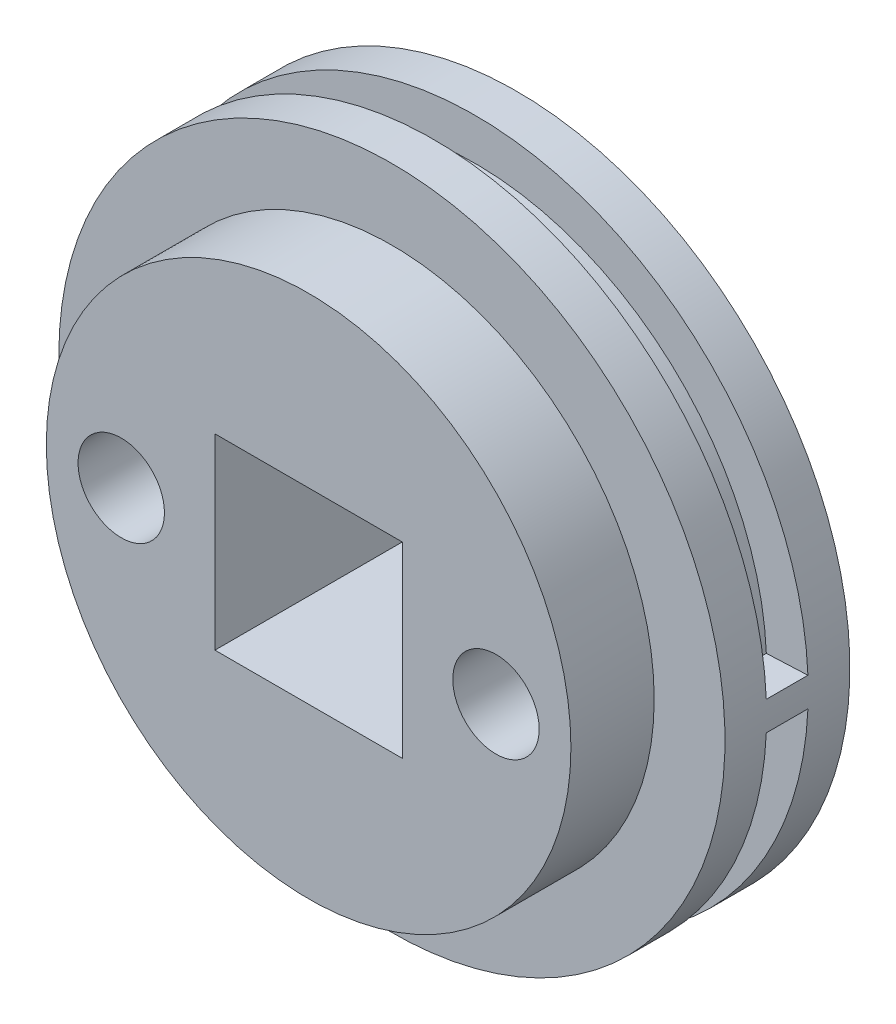
ISO-10303-21;
HEADER;
FILE_DESCRIPTION(('STEP AP214'),'2;1');
FILE_NAME('part.step','',(''),(''),'','','');
FILE_SCHEMA(('AUTOMOTIVE_DESIGN { 1 0 10303 214 1 1 1 1 }'));
ENDSEC;
DATA;
#1=APPLICATION_CONTEXT('core data for automotive mechanical design processes');
#2=APPLICATION_PROTOCOL_DEFINITION('international standard','automotive_design',2000,#1);
#3=PRODUCT_CONTEXT('',#1,'mechanical');
#4=PRODUCT('Part','Part','',(#3));
#5=PRODUCT_RELATED_PRODUCT_CATEGORY('part','',(#4));
#6=PRODUCT_DEFINITION_FORMATION('','',#4);
#7=PRODUCT_DEFINITION_CONTEXT('part definition',#1,'design');
#8=PRODUCT_DEFINITION('design','',#6,#7);
#9=PRODUCT_DEFINITION_SHAPE('','',#8);
#10=(LENGTH_UNIT() NAMED_UNIT(*) SI_UNIT(.MILLI.,.METRE.));
#11=(NAMED_UNIT(*) PLANE_ANGLE_UNIT() SI_UNIT($,.RADIAN.));
#12=(NAMED_UNIT(*) SI_UNIT($,.STERADIAN.) SOLID_ANGLE_UNIT());
#13=UNCERTAINTY_MEASURE_WITH_UNIT(LENGTH_MEASURE(1.E-05),#10,'distance_accuracy_value','');
#14=(GEOMETRIC_REPRESENTATION_CONTEXT(3) GLOBAL_UNCERTAINTY_ASSIGNED_CONTEXT((#13)) GLOBAL_UNIT_ASSIGNED_CONTEXT((#10,
#11,#12)) REPRESENTATION_CONTEXT('',''));
#15=CARTESIAN_POINT('',(0.,0.,0.));
#16=DIRECTION('',(0.,0.,1.));
#17=DIRECTION('',(1.,0.,0.));
#18=AXIS2_PLACEMENT_3D('',#15,#16,#17);
#19=CARTESIAN_POINT('',(9.,0.,-25.));
#20=DIRECTION('',(0.,0.,1.));
#21=DIRECTION('',(1.,0.,0.));
#22=AXIS2_PLACEMENT_3D('',#19,#20,#21);
#23=CYLINDRICAL_SURFACE('',#22,2.075);
#24=CARTESIAN_POINT('',(9.,0.,4.));
#25=DIRECTION('',(0.,0.,1.));
#26=DIRECTION('',(1.,0.,0.));
#27=AXIS2_PLACEMENT_3D('',#24,#25,#26);
#28=CIRCLE('',#27,2.075);
#29=CARTESIAN_POINT('',(11.075,0.,4.));
#30=VERTEX_POINT('',#29);
#31=EDGE_CURVE('E334',#30,#30,#28,.T.);
#32=ORIENTED_EDGE('',*,*,#31,.T.);
#33=EDGE_LOOP('',(#32));
#34=FACE_BOUND('',#33,.T.);
#35=CARTESIAN_POINT('',(9.,0.,-2.5));
#36=DIRECTION('',(0.,0.,-1.));
#37=DIRECTION('',(-1.,0.,0.));
#38=AXIS2_PLACEMENT_3D('',#35,#36,#37);
#39=CIRCLE('',#38,2.075);
#40=CARTESIAN_POINT('',(6.925,0.,-2.5));
#41=VERTEX_POINT('',#40);
#42=EDGE_CURVE('E338',#41,#41,#39,.F.);
#43=ORIENTED_EDGE('',*,*,#42,.F.);
#44=EDGE_LOOP('',(#43));
#45=FACE_BOUND('',#44,.T.);
#46=ADVANCED_FACE('F45',(#34,#45),#23,.F.);
#47=CARTESIAN_POINT('',(-9.,0.,-25.));
#48=DIRECTION('',(0.,0.,1.));
#49=DIRECTION('',(1.,0.,0.));
#50=AXIS2_PLACEMENT_3D('',#47,#48,#49);
#51=CYLINDRICAL_SURFACE('',#50,2.075);
#52=CARTESIAN_POINT('',(-9.,0.,4.));
#53=DIRECTION('',(0.,0.,1.));
#54=DIRECTION('',(1.,0.,0.));
#55=AXIS2_PLACEMENT_3D('',#52,#53,#54);
#56=CIRCLE('',#55,2.075);
#57=CARTESIAN_POINT('',(-6.925,0.,4.));
#58=VERTEX_POINT('',#57);
#59=EDGE_CURVE('E329',#58,#58,#56,.T.);
#60=ORIENTED_EDGE('',*,*,#59,.T.);
#61=EDGE_LOOP('',(#60));
#62=FACE_BOUND('',#61,.T.);
#63=CARTESIAN_POINT('',(-9.,0.,-2.5));
#64=DIRECTION('',(0.,0.,-1.));
#65=DIRECTION('',(-1.,0.,0.));
#66=AXIS2_PLACEMENT_3D('',#63,#64,#65);
#67=CIRCLE('',#66,2.075);
#68=CARTESIAN_POINT('',(-11.075,0.,-2.5));
#69=VERTEX_POINT('',#68);
#70=EDGE_CURVE('E277',#69,#69,#67,.F.);
#71=ORIENTED_EDGE('',*,*,#70,.F.);
#72=EDGE_LOOP('',(#71));
#73=FACE_BOUND('',#72,.T.);
#74=ADVANCED_FACE('F388',(#62,#73),#51,.F.);
#75=CARTESIAN_POINT('',(0.,0.,4.));
#76=DIRECTION('',(0.,0.,-1.));
#77=DIRECTION('',(-1.,0.,0.));
#78=AXIS2_PLACEMENT_3D('',#75,#76,#77);
#79=CYLINDRICAL_SURFACE('',#78,12.6);
#80=CARTESIAN_POINT('',(0.,0.,4.));
#81=DIRECTION('',(0.,0.,1.));
#82=DIRECTION('',(1.,0.,0.));
#83=AXIS2_PLACEMENT_3D('',#80,#81,#82);
#84=CIRCLE('',#83,12.6);
#85=CARTESIAN_POINT('',(12.6,0.,4.));
#86=VERTEX_POINT('',#85);
#87=EDGE_CURVE('E346',#86,#86,#84,.T.);
#88=ORIENTED_EDGE('',*,*,#87,.F.);
#89=EDGE_LOOP('',(#88));
#90=FACE_BOUND('',#89,.T.);
#91=CARTESIAN_POINT('',(0.,0.,0.));
#92=DIRECTION('',(0.,0.,1.));
#93=DIRECTION('',(1.,0.,0.));
#94=AXIS2_PLACEMENT_3D('',#91,#92,#93);
#95=CIRCLE('',#94,12.6);
#96=CARTESIAN_POINT('',(12.6,0.,0.));
#97=VERTEX_POINT('',#96);
#98=EDGE_CURVE('E342',#97,#97,#95,.T.);
#99=ORIENTED_EDGE('',*,*,#98,.T.);
#100=EDGE_LOOP('',(#99));
#101=FACE_BOUND('',#100,.T.);
#102=ADVANCED_FACE('F47',(#90,#101),#79,.T.);
#103=CARTESIAN_POINT('',(0.,0.,4.));
#104=DIRECTION('',(0.,0.,1.));
#105=DIRECTION('',(1.,0.,0.));
#106=AXIS2_PLACEMENT_3D('',#103,#104,#105);
#107=PLANE('',#106);
#108=DIRECTION('',(0.,1.,0.));
#109=VECTOR('',#108,1.);
#110=CARTESIAN_POINT('',(-4.5,4.5,4.));
#111=LINE('',#110,#109);
#112=CARTESIAN_POINT('',(-4.5,-4.5,4.));
#113=VERTEX_POINT('',#112);
#114=CARTESIAN_POINT('',(-4.5,4.5,4.));
#115=VERTEX_POINT('',#114);
#116=EDGE_CURVE('E201',#113,#115,#111,.T.);
#117=ORIENTED_EDGE('',*,*,#116,.T.);
#118=DIRECTION('',(1.,0.,0.));
#119=VECTOR('',#118,1.);
#120=CARTESIAN_POINT('',(4.5,4.5,4.));
#121=LINE('',#120,#119);
#122=CARTESIAN_POINT('',(4.5,4.5,4.));
#123=VERTEX_POINT('',#122);
#124=EDGE_CURVE('E205',#115,#123,#121,.T.);
#125=ORIENTED_EDGE('',*,*,#124,.T.);
#126=DIRECTION('',(0.,-1.,0.));
#127=VECTOR('',#126,1.);
#128=CARTESIAN_POINT('',(4.5,4.5,4.));
#129=LINE('',#128,#127);
#130=CARTESIAN_POINT('',(4.5,-4.5,4.));
#131=VERTEX_POINT('',#130);
#132=EDGE_CURVE('E61',#123,#131,#129,.T.);
#133=ORIENTED_EDGE('',*,*,#132,.T.);
#134=DIRECTION('',(-1.,0.,0.));
#135=VECTOR('',#134,1.);
#136=CARTESIAN_POINT('',(4.5,-4.5,4.));
#137=LINE('',#136,#135);
#138=EDGE_CURVE('E212',#131,#113,#137,.T.);
#139=ORIENTED_EDGE('',*,*,#138,.T.);
#140=EDGE_LOOP('',(#117,#125,#133,#139));
#141=FACE_BOUND('',#140,.T.);
#142=ORIENTED_EDGE('',*,*,#59,.F.);
#143=EDGE_LOOP('',(#142));
#144=FACE_BOUND('',#143,.T.);
#145=ORIENTED_EDGE('',*,*,#31,.F.);
#146=EDGE_LOOP('',(#145));
#147=FACE_BOUND('',#146,.T.);
#148=ORIENTED_EDGE('',*,*,#87,.T.);
#149=EDGE_LOOP('',(#148));
#150=FACE_BOUND('',#149,.T.);
#151=ADVANCED_FACE('F409',(#141,#144,#147,#150),#107,.T.);
#152=CARTESIAN_POINT('',(0.,0.,-6.));
#153=DIRECTION('',(0.,0.,1.));
#154=DIRECTION('',(1.,0.,0.));
#155=AXIS2_PLACEMENT_3D('',#152,#153,#154);
#156=CYLINDRICAL_SURFACE('',#155,16.);
#157=DIRECTION('',(0.,0.,1.));
#158=VECTOR('',#157,1.);
#159=CARTESIAN_POINT('',(15.9847715453097,0.697910197845271,-6.));
#160=LINE('',#159,#158);
#161=CARTESIAN_POINT('',(15.9847715453097,0.697910197845271,-4.));
#162=VERTEX_POINT('',#161);
#163=CARTESIAN_POINT('',(15.9847715453097,0.697910197845271,-2.));
#164=VERTEX_POINT('',#163);
#165=EDGE_CURVE('E11',#162,#164,#160,.T.);
#166=ORIENTED_EDGE('',*,*,#165,.T.);
#167=CARTESIAN_POINT('',(0.,0.,-2.));
#168=DIRECTION('',(0.,0.,1.));
#169=DIRECTION('',(1.,0.,0.));
#170=AXIS2_PLACEMENT_3D('',#167,#168,#169);
#171=CIRCLE('',#170,16.);
#172=CARTESIAN_POINT('',(15.9847715453097,-0.697910197845271,-2.));
#173=VERTEX_POINT('',#172);
#174=EDGE_CURVE('E362',#164,#173,#171,.T.);
#175=ORIENTED_EDGE('',*,*,#174,.T.);
#176=DIRECTION('',(0.,0.,1.));
#177=VECTOR('',#176,1.);
#178=CARTESIAN_POINT('',(15.9847715453097,-0.697910197845271,-6.));
#179=LINE('',#178,#177);
#180=CARTESIAN_POINT('',(15.9847715453097,-0.697910197845271,-4.));
#181=VERTEX_POINT('',#180);
#182=EDGE_CURVE('E54',#173,#181,#179,.F.);
#183=ORIENTED_EDGE('',*,*,#182,.T.);
#184=CARTESIAN_POINT('',(0.,0.,-4.));
#185=DIRECTION('',(0.,0.,-1.));
#186=DIRECTION('',(-1.,0.,0.));
#187=AXIS2_PLACEMENT_3D('',#184,#185,#186);
#188=CIRCLE('',#187,16.);
#189=EDGE_CURVE('E350',#181,#162,#188,.T.);
#190=ORIENTED_EDGE('',*,*,#189,.T.);
#191=EDGE_LOOP('',(#166,#175,#183,#190));
#192=FACE_BOUND('',#191,.T.);
#193=CARTESIAN_POINT('',(0.,0.,-6.));
#194=DIRECTION('',(0.,0.,-1.));
#195=DIRECTION('',(-1.,0.,0.));
#196=AXIS2_PLACEMENT_3D('',#193,#194,#195);
#197=CIRCLE('',#196,16.);
#198=CARTESIAN_POINT('',(-16.,0.,-6.));
#199=VERTEX_POINT('',#198);
#200=EDGE_CURVE('E339',#199,#199,#197,.T.);
#201=ORIENTED_EDGE('',*,*,#200,.F.);
#202=EDGE_LOOP('',(#201));
#203=FACE_BOUND('',#202,.T.);
#204=CARTESIAN_POINT('',(0.,0.,0.));
#205=DIRECTION('',(0.,0.,-1.));
#206=DIRECTION('',(-1.,0.,0.));
#207=AXIS2_PLACEMENT_3D('',#204,#205,#206);
#208=CIRCLE('',#207,16.);
#209=CARTESIAN_POINT('',(-16.,0.,0.));
#210=VERTEX_POINT('',#209);
#211=EDGE_CURVE('E333',#210,#210,#208,.T.);
#212=ORIENTED_EDGE('',*,*,#211,.T.);
#213=EDGE_LOOP('',(#212));
#214=FACE_BOUND('',#213,.T.);
#215=ADVANCED_FACE('F368',(#192,#203,#214),#156,.T.);
#216=CARTESIAN_POINT('',(0.,0.,-6.));
#217=DIRECTION('',(0.,0.,-1.));
#218=DIRECTION('',(-1.,0.,0.));
#219=AXIS2_PLACEMENT_3D('',#216,#217,#218);
#220=PLANE('',#219);
#221=DIRECTION('',(0.,1.,0.));
#222=VECTOR('',#221,1.);
#223=CARTESIAN_POINT('',(-4.5,4.5,-6.));
#224=LINE('',#223,#222);
#225=CARTESIAN_POINT('',(-4.5,-4.5,-6.));
#226=VERTEX_POINT('',#225);
#227=CARTESIAN_POINT('',(-4.5,4.5,-6.));
#228=VERTEX_POINT('',#227);
#229=EDGE_CURVE('E69',#226,#228,#224,.T.);
#230=ORIENTED_EDGE('',*,*,#229,.F.);
#231=DIRECTION('',(-1.,0.,0.));
#232=VECTOR('',#231,1.);
#233=CARTESIAN_POINT('',(4.5,-4.5,-6.));
#234=LINE('',#233,#232);
#235=CARTESIAN_POINT('',(4.5,-4.5,-6.));
#236=VERTEX_POINT('',#235);
#237=EDGE_CURVE('E206',#236,#226,#234,.T.);
#238=ORIENTED_EDGE('',*,*,#237,.F.);
#239=DIRECTION('',(0.,-1.,0.));
#240=VECTOR('',#239,1.);
#241=CARTESIAN_POINT('',(4.5,4.5,-6.));
#242=LINE('',#241,#240);
#243=CARTESIAN_POINT('',(4.5,4.5,-6.));
#244=VERTEX_POINT('',#243);
#245=EDGE_CURVE('E223',#244,#236,#242,.T.);
#246=ORIENTED_EDGE('',*,*,#245,.F.);
#247=DIRECTION('',(1.,0.,0.));
#248=VECTOR('',#247,1.);
#249=CARTESIAN_POINT('',(4.5,4.5,-6.));
#250=LINE('',#249,#248);
#251=EDGE_CURVE('E219',#228,#244,#250,.T.);
#252=ORIENTED_EDGE('',*,*,#251,.F.);
#253=EDGE_LOOP('',(#230,#238,#246,#252));
#254=FACE_BOUND('',#253,.T.);
#255=DIRECTION('',(0.,1.,0.));
#256=VECTOR('',#255,1.);
#257=CARTESIAN_POINT('',(5.5,3.5,-6.));
#258=LINE('',#257,#256);
#259=CARTESIAN_POINT('',(5.5,-3.5,-6.));
#260=VERTEX_POINT('',#259);
#261=CARTESIAN_POINT('',(5.5,3.5,-6.));
#262=VERTEX_POINT('',#261);
#263=EDGE_CURVE('E259',#260,#262,#258,.T.);
#264=ORIENTED_EDGE('',*,*,#263,.F.);
#265=DIRECTION('',(-1.,0.,0.));
#266=VECTOR('',#265,1.);
#267=CARTESIAN_POINT('',(12.5,-3.5,-6.));
#268=LINE('',#267,#266);
#269=CARTESIAN_POINT('',(12.5,-3.5,-6.));
#270=VERTEX_POINT('',#269);
#271=EDGE_CURVE('E246',#270,#260,#268,.T.);
#272=ORIENTED_EDGE('',*,*,#271,.F.);
#273=DIRECTION('',(0.,-1.,0.));
#274=VECTOR('',#273,1.);
#275=CARTESIAN_POINT('',(12.5,3.5,-6.));
#276=LINE('',#275,#274);
#277=CARTESIAN_POINT('',(12.5,3.5,-6.));
#278=VERTEX_POINT('',#277);
#279=EDGE_CURVE('E267',#278,#270,#276,.T.);
#280=ORIENTED_EDGE('',*,*,#279,.F.);
#281=DIRECTION('',(1.,0.,0.));
#282=VECTOR('',#281,1.);
#283=CARTESIAN_POINT('',(12.5,3.5,-6.));
#284=LINE('',#283,#282);
#285=EDGE_CURVE('E262',#262,#278,#284,.T.);
#286=ORIENTED_EDGE('',*,*,#285,.F.);
#287=EDGE_LOOP('',(#264,#272,#280,#286));
#288=FACE_BOUND('',#287,.T.);
#289=DIRECTION('',(0.,1.,0.));
#290=VECTOR('',#289,1.);
#291=CARTESIAN_POINT('',(-12.5,3.5,-6.));
#292=LINE('',#291,#290);
#293=CARTESIAN_POINT('',(-12.5,-3.5,-6.));
#294=VERTEX_POINT('',#293);
#295=CARTESIAN_POINT('',(-12.5,3.5,-6.));
#296=VERTEX_POINT('',#295);
#297=EDGE_CURVE('E233',#294,#296,#292,.T.);
#298=ORIENTED_EDGE('',*,*,#297,.F.);
#299=DIRECTION('',(-1.,0.,0.));
#300=VECTOR('',#299,1.);
#301=CARTESIAN_POINT('',(-5.5,-3.5,-6.));
#302=LINE('',#301,#300);
#303=CARTESIAN_POINT('',(-5.5,-3.5,-6.));
#304=VERTEX_POINT('',#303);
#305=EDGE_CURVE('E292',#304,#294,#302,.T.);
#306=ORIENTED_EDGE('',*,*,#305,.F.);
#307=DIRECTION('',(0.,-1.,0.));
#308=VECTOR('',#307,1.);
#309=CARTESIAN_POINT('',(-5.5,3.5,-6.));
#310=LINE('',#309,#308);
#311=CARTESIAN_POINT('',(-5.5,3.5,-6.));
#312=VERTEX_POINT('',#311);
#313=EDGE_CURVE('E311',#312,#304,#310,.T.);
#314=ORIENTED_EDGE('',*,*,#313,.F.);
#315=DIRECTION('',(1.,0.,0.));
#316=VECTOR('',#315,1.);
#317=CARTESIAN_POINT('',(-5.5,3.5,-6.));
#318=LINE('',#317,#316);
#319=EDGE_CURVE('E307',#296,#312,#318,.T.);
#320=ORIENTED_EDGE('',*,*,#319,.F.);
#321=EDGE_LOOP('',(#298,#306,#314,#320));
#322=FACE_BOUND('',#321,.T.);
#323=ORIENTED_EDGE('',*,*,#200,.T.);
#324=EDGE_LOOP('',(#323));
#325=FACE_BOUND('',#324,.T.);
#326=ADVANCED_FACE('F399',(#254,#288,#322,#325),#220,.T.);
#327=CARTESIAN_POINT('',(0.,0.,0.));
#328=DIRECTION('',(0.,0.,-1.));
#329=DIRECTION('',(-1.,0.,0.));
#330=AXIS2_PLACEMENT_3D('',#327,#328,#329);
#331=PLANE('',#330);
#332=ORIENTED_EDGE('',*,*,#98,.F.);
#333=EDGE_LOOP('',(#332));
#334=FACE_BOUND('',#333,.T.);
#335=ORIENTED_EDGE('',*,*,#211,.F.);
#336=EDGE_LOOP('',(#335));
#337=FACE_BOUND('',#336,.T.);
#338=ADVANCED_FACE('F402',(#334,#337),#331,.F.);
#339=CARTESIAN_POINT('',(0.,0.,-2.5));
#340=DIRECTION('',(0.,0.,-1.));
#341=DIRECTION('',(-1.,0.,0.));
#342=AXIS2_PLACEMENT_3D('',#339,#340,#341);
#343=PLANE('',#342);
#344=DIRECTION('',(0.,1.,0.));
#345=VECTOR('',#344,1.);
#346=CARTESIAN_POINT('',(-12.5,3.5,-2.5));
#347=LINE('',#346,#345);
#348=CARTESIAN_POINT('',(-12.5,-3.5,-2.5));
#349=VERTEX_POINT('',#348);
#350=CARTESIAN_POINT('',(-12.5,3.5,-2.5));
#351=VERTEX_POINT('',#350);
#352=EDGE_CURVE('E287',#349,#351,#347,.T.);
#353=ORIENTED_EDGE('',*,*,#352,.T.);
#354=DIRECTION('',(1.,0.,0.));
#355=VECTOR('',#354,1.);
#356=CARTESIAN_POINT('',(-5.5,3.5,-2.5));
#357=LINE('',#356,#355);
#358=CARTESIAN_POINT('',(-5.5,3.5,-2.5));
#359=VERTEX_POINT('',#358);
#360=EDGE_CURVE('E291',#351,#359,#357,.T.);
#361=ORIENTED_EDGE('',*,*,#360,.T.);
#362=DIRECTION('',(0.,-1.,0.));
#363=VECTOR('',#362,1.);
#364=CARTESIAN_POINT('',(-5.5,3.5,-2.5));
#365=LINE('',#364,#363);
#366=CARTESIAN_POINT('',(-5.5,-3.5,-2.5));
#367=VERTEX_POINT('',#366);
#368=EDGE_CURVE('E296',#359,#367,#365,.T.);
#369=ORIENTED_EDGE('',*,*,#368,.T.);
#370=DIRECTION('',(-1.,0.,0.));
#371=VECTOR('',#370,1.);
#372=CARTESIAN_POINT('',(-5.5,-3.5,-2.5));
#373=LINE('',#372,#371);
#374=EDGE_CURVE('E300',#367,#349,#373,.T.);
#375=ORIENTED_EDGE('',*,*,#374,.T.);
#376=EDGE_LOOP('',(#353,#361,#369,#375));
#377=FACE_BOUND('',#376,.T.);
#378=ORIENTED_EDGE('',*,*,#70,.T.);
#379=EDGE_LOOP('',(#378));
#380=FACE_BOUND('',#379,.T.);
#381=ADVANCED_FACE('F406',(#377,#380),#343,.T.);
#382=CARTESIAN_POINT('',(-12.5,3.5,-2.5));
#383=DIRECTION('',(-1.,0.,0.));
#384=DIRECTION('',(0.,0.,1.));
#385=AXIS2_PLACEMENT_3D('',#382,#383,#384);
#386=PLANE('',#385);
#387=ORIENTED_EDGE('',*,*,#297,.T.);
#388=DIRECTION('',(0.,0.,-1.));
#389=VECTOR('',#388,1.);
#390=CARTESIAN_POINT('',(-12.5,3.5,-2.5));
#391=LINE('',#390,#389);
#392=EDGE_CURVE('E304',#351,#296,#391,.T.);
#393=ORIENTED_EDGE('',*,*,#392,.F.);
#394=ORIENTED_EDGE('',*,*,#352,.F.);
#395=DIRECTION('',(0.,0.,-1.));
#396=VECTOR('',#395,1.);
#397=CARTESIAN_POINT('',(-12.5,-3.5,-2.5));
#398=LINE('',#397,#396);
#399=EDGE_CURVE('E263',#349,#294,#398,.T.);
#400=ORIENTED_EDGE('',*,*,#399,.T.);
#401=EDGE_LOOP('',(#387,#393,#394,#400));
#402=FACE_BOUND('',#401,.T.);
#403=ADVANCED_FACE('F432',(#402),#386,.F.);
#404=CARTESIAN_POINT('',(-5.5,-3.5,-2.5));
#405=DIRECTION('',(0.,-1.,0.));
#406=DIRECTION('',(0.,0.,-1.));
#407=AXIS2_PLACEMENT_3D('',#404,#405,#406);
#408=PLANE('',#407);
#409=ORIENTED_EDGE('',*,*,#305,.T.);
#410=ORIENTED_EDGE('',*,*,#399,.F.);
#411=ORIENTED_EDGE('',*,*,#374,.F.);
#412=DIRECTION('',(0.,0.,-1.));
#413=VECTOR('',#412,1.);
#414=CARTESIAN_POINT('',(-5.5,-3.5,-2.5));
#415=LINE('',#414,#413);
#416=EDGE_CURVE('E320',#367,#304,#415,.T.);
#417=ORIENTED_EDGE('',*,*,#416,.T.);
#418=EDGE_LOOP('',(#409,#410,#411,#417));
#419=FACE_BOUND('',#418,.T.);
#420=ADVANCED_FACE('F438',(#419),#408,.F.);
#421=CARTESIAN_POINT('',(-5.5,3.5,-2.5));
#422=DIRECTION('',(1.,0.,0.));
#423=DIRECTION('',(0.,1.,0.));
#424=AXIS2_PLACEMENT_3D('',#421,#422,#423);
#425=PLANE('',#424);
#426=ORIENTED_EDGE('',*,*,#313,.T.);
#427=ORIENTED_EDGE('',*,*,#416,.F.);
#428=ORIENTED_EDGE('',*,*,#368,.F.);
#429=DIRECTION('',(0.,0.,-1.));
#430=VECTOR('',#429,1.);
#431=CARTESIAN_POINT('',(-5.5,3.5,-2.5));
#432=LINE('',#431,#430);
#433=EDGE_CURVE('E323',#359,#312,#432,.T.);
#434=ORIENTED_EDGE('',*,*,#433,.T.);
#435=EDGE_LOOP('',(#426,#427,#428,#434));
#436=FACE_BOUND('',#435,.T.);
#437=ADVANCED_FACE('F446',(#436),#425,.F.);
#438=CARTESIAN_POINT('',(-5.5,3.5,-2.5));
#439=DIRECTION('',(0.,1.,0.));
#440=DIRECTION('',(0.,0.,1.));
#441=AXIS2_PLACEMENT_3D('',#438,#439,#440);
#442=PLANE('',#441);
#443=ORIENTED_EDGE('',*,*,#319,.T.);
#444=ORIENTED_EDGE('',*,*,#433,.F.);
#445=ORIENTED_EDGE('',*,*,#360,.F.);
#446=ORIENTED_EDGE('',*,*,#392,.T.);
#447=EDGE_LOOP('',(#443,#444,#445,#446));
#448=FACE_BOUND('',#447,.T.);
#449=ADVANCED_FACE('F450',(#448),#442,.F.);
#450=CARTESIAN_POINT('',(0.,0.,-2.5));
#451=DIRECTION('',(0.,0.,-1.));
#452=DIRECTION('',(-1.,0.,0.));
#453=AXIS2_PLACEMENT_3D('',#450,#451,#452);
#454=PLANE('',#453);
#455=DIRECTION('',(0.,1.,0.));
#456=VECTOR('',#455,1.);
#457=CARTESIAN_POINT('',(5.5,3.5,-2.5));
#458=LINE('',#457,#456);
#459=CARTESIAN_POINT('',(5.5,-3.5,-2.5));
#460=VERTEX_POINT('',#459);
#461=CARTESIAN_POINT('',(5.5,3.5,-2.5));
#462=VERTEX_POINT('',#461);
#463=EDGE_CURVE('E241',#460,#462,#458,.T.);
#464=ORIENTED_EDGE('',*,*,#463,.T.);
#465=DIRECTION('',(1.,0.,0.));
#466=VECTOR('',#465,1.);
#467=CARTESIAN_POINT('',(12.5,3.5,-2.5));
#468=LINE('',#467,#466);
#469=CARTESIAN_POINT('',(12.5,3.5,-2.5));
#470=VERTEX_POINT('',#469);
#471=EDGE_CURVE('E245',#462,#470,#468,.T.);
#472=ORIENTED_EDGE('',*,*,#471,.T.);
#473=DIRECTION('',(0.,-1.,0.));
#474=VECTOR('',#473,1.);
#475=CARTESIAN_POINT('',(12.5,3.5,-2.5));
#476=LINE('',#475,#474);
#477=CARTESIAN_POINT('',(12.5,-3.5,-2.5));
#478=VERTEX_POINT('',#477);
#479=EDGE_CURVE('E250',#470,#478,#476,.T.);
#480=ORIENTED_EDGE('',*,*,#479,.T.);
#481=DIRECTION('',(-1.,0.,0.));
#482=VECTOR('',#481,1.);
#483=CARTESIAN_POINT('',(12.5,-3.5,-2.5));
#484=LINE('',#483,#482);
#485=EDGE_CURVE('E254',#478,#460,#484,.T.);
#486=ORIENTED_EDGE('',*,*,#485,.T.);
#487=EDGE_LOOP('',(#464,#472,#480,#486));
#488=FACE_BOUND('',#487,.T.);
#489=ORIENTED_EDGE('',*,*,#42,.T.);
#490=EDGE_LOOP('',(#489));
#491=FACE_BOUND('',#490,.T.);
#492=ADVANCED_FACE('F453',(#488,#491),#454,.T.);
#493=CARTESIAN_POINT('',(5.5,3.5,-2.5));
#494=DIRECTION('',(-1.,0.,0.));
#495=DIRECTION('',(0.,0.,1.));
#496=AXIS2_PLACEMENT_3D('',#493,#494,#495);
#497=PLANE('',#496);
#498=ORIENTED_EDGE('',*,*,#263,.T.);
#499=DIRECTION('',(0.,0.,-1.));
#500=VECTOR('',#499,1.);
#501=CARTESIAN_POINT('',(5.5,3.5,-2.5));
#502=LINE('',#501,#500);
#503=EDGE_CURVE('E258',#462,#262,#502,.T.);
#504=ORIENTED_EDGE('',*,*,#503,.F.);
#505=ORIENTED_EDGE('',*,*,#463,.F.);
#506=DIRECTION('',(0.,0.,-1.));
#507=VECTOR('',#506,1.);
#508=CARTESIAN_POINT('',(5.5,-3.5,-2.5));
#509=LINE('',#508,#507);
#510=EDGE_CURVE('E274',#460,#260,#509,.T.);
#511=ORIENTED_EDGE('',*,*,#510,.T.);
#512=EDGE_LOOP('',(#498,#504,#505,#511));
#513=FACE_BOUND('',#512,.T.);
#514=ADVANCED_FACE('F442',(#513),#497,.F.);
#515=CARTESIAN_POINT('',(12.5,-3.5,-2.5));
#516=DIRECTION('',(0.,-1.,0.));
#517=DIRECTION('',(0.,0.,-1.));
#518=AXIS2_PLACEMENT_3D('',#515,#516,#517);
#519=PLANE('',#518);
#520=ORIENTED_EDGE('',*,*,#271,.T.);
#521=ORIENTED_EDGE('',*,*,#510,.F.);
#522=ORIENTED_EDGE('',*,*,#485,.F.);
#523=DIRECTION('',(0.,0.,-1.));
#524=VECTOR('',#523,1.);
#525=CARTESIAN_POINT('',(12.5,-3.5,-2.5));
#526=LINE('',#525,#524);
#527=EDGE_CURVE('E278',#478,#270,#526,.T.);
#528=ORIENTED_EDGE('',*,*,#527,.T.);
#529=EDGE_LOOP('',(#520,#521,#522,#528));
#530=FACE_BOUND('',#529,.T.);
#531=ADVANCED_FACE('F474',(#530),#519,.F.);
#532=CARTESIAN_POINT('',(12.5,3.5,-2.5));
#533=DIRECTION('',(1.,0.,0.));
#534=DIRECTION('',(0.,1.,0.));
#535=AXIS2_PLACEMENT_3D('',#532,#533,#534);
#536=PLANE('',#535);
#537=ORIENTED_EDGE('',*,*,#279,.T.);
#538=ORIENTED_EDGE('',*,*,#527,.F.);
#539=ORIENTED_EDGE('',*,*,#479,.F.);
#540=DIRECTION('',(0.,0.,-1.));
#541=VECTOR('',#540,1.);
#542=CARTESIAN_POINT('',(12.5,3.5,-2.5));
#543=LINE('',#542,#541);
#544=EDGE_CURVE('E281',#470,#278,#543,.T.);
#545=ORIENTED_EDGE('',*,*,#544,.T.);
#546=EDGE_LOOP('',(#537,#538,#539,#545));
#547=FACE_BOUND('',#546,.T.);
#548=ADVANCED_FACE('F482',(#547),#536,.F.);
#549=CARTESIAN_POINT('',(12.5,3.5,-2.5));
#550=DIRECTION('',(0.,1.,0.));
#551=DIRECTION('',(0.,0.,1.));
#552=AXIS2_PLACEMENT_3D('',#549,#550,#551);
#553=PLANE('',#552);
#554=ORIENTED_EDGE('',*,*,#285,.T.);
#555=ORIENTED_EDGE('',*,*,#544,.F.);
#556=ORIENTED_EDGE('',*,*,#471,.F.);
#557=ORIENTED_EDGE('',*,*,#503,.T.);
#558=EDGE_LOOP('',(#554,#555,#556,#557));
#559=FACE_BOUND('',#558,.T.);
#560=ADVANCED_FACE('F485',(#559),#553,.F.);
#561=CARTESIAN_POINT('',(-4.5,4.5,4.));
#562=DIRECTION('',(-1.,0.,0.));
#563=DIRECTION('',(0.,-1.,0.));
#564=AXIS2_PLACEMENT_3D('',#561,#562,#563);
#565=PLANE('',#564);
#566=ORIENTED_EDGE('',*,*,#229,.T.);
#567=DIRECTION('',(0.,0.,-1.));
#568=VECTOR('',#567,1.);
#569=CARTESIAN_POINT('',(-4.5,4.5,4.));
#570=LINE('',#569,#568);
#571=EDGE_CURVE('E216',#115,#228,#570,.T.);
#572=ORIENTED_EDGE('',*,*,#571,.F.);
#573=ORIENTED_EDGE('',*,*,#116,.F.);
#574=DIRECTION('',(0.,0.,-1.));
#575=VECTOR('',#574,1.);
#576=CARTESIAN_POINT('',(-4.5,-4.5,4.));
#577=LINE('',#576,#575);
#578=EDGE_CURVE('E230',#113,#226,#577,.T.);
#579=ORIENTED_EDGE('',*,*,#578,.T.);
#580=EDGE_LOOP('',(#566,#572,#573,#579));
#581=FACE_BOUND('',#580,.T.);
#582=ADVANCED_FACE('F479',(#581),#565,.F.);
#583=CARTESIAN_POINT('',(4.5,-4.5,4.));
#584=DIRECTION('',(0.,-1.,0.));
#585=DIRECTION('',(0.,0.,-1.));
#586=AXIS2_PLACEMENT_3D('',#583,#584,#585);
#587=PLANE('',#586);
#588=ORIENTED_EDGE('',*,*,#237,.T.);
#589=ORIENTED_EDGE('',*,*,#578,.F.);
#590=ORIENTED_EDGE('',*,*,#138,.F.);
#591=DIRECTION('',(0.,0.,-1.));
#592=VECTOR('',#591,1.);
#593=CARTESIAN_POINT('',(4.5,-4.5,4.));
#594=LINE('',#593,#592);
#595=EDGE_CURVE('E234',#131,#236,#594,.T.);
#596=ORIENTED_EDGE('',*,*,#595,.T.);
#597=EDGE_LOOP('',(#588,#589,#590,#596));
#598=FACE_BOUND('',#597,.T.);
#599=ADVANCED_FACE('F492',(#598),#587,.F.);
#600=CARTESIAN_POINT('',(4.5,4.5,4.));
#601=DIRECTION('',(1.,0.,0.));
#602=DIRECTION('',(0.,0.,-1.));
#603=AXIS2_PLACEMENT_3D('',#600,#601,#602);
#604=PLANE('',#603);
#605=ORIENTED_EDGE('',*,*,#245,.T.);
#606=ORIENTED_EDGE('',*,*,#595,.F.);
#607=ORIENTED_EDGE('',*,*,#132,.F.);
#608=DIRECTION('',(0.,0.,-1.));
#609=VECTOR('',#608,1.);
#610=CARTESIAN_POINT('',(4.5,4.5,4.));
#611=LINE('',#610,#609);
#612=EDGE_CURVE('E237',#123,#244,#611,.T.);
#613=ORIENTED_EDGE('',*,*,#612,.T.);
#614=EDGE_LOOP('',(#605,#606,#607,#613));
#615=FACE_BOUND('',#614,.T.);
#616=ADVANCED_FACE('F383',(#615),#604,.F.);
#617=CARTESIAN_POINT('',(4.5,4.5,4.));
#618=DIRECTION('',(0.,1.,0.));
#619=DIRECTION('',(0.,0.,1.));
#620=AXIS2_PLACEMENT_3D('',#617,#618,#619);
#621=PLANE('',#620);
#622=ORIENTED_EDGE('',*,*,#251,.T.);
#623=ORIENTED_EDGE('',*,*,#612,.F.);
#624=ORIENTED_EDGE('',*,*,#124,.F.);
#625=ORIENTED_EDGE('',*,*,#571,.T.);
#626=EDGE_LOOP('',(#622,#623,#624,#625));
#627=FACE_BOUND('',#626,.T.);
#628=ADVANCED_FACE('F376',(#627),#621,.F.);
#629=CARTESIAN_POINT('',(17.9828679884734,-0.785148972575929,-2.));
#630=DIRECTION('',(0.,0.,1.));
#631=DIRECTION('',(1.,0.,0.));
#632=AXIS2_PLACEMENT_3D('',#629,#630,#631);
#633=PLANE('',#632);
#634=ORIENTED_EDGE('',*,*,#174,.F.);
#635=DIRECTION('',(-0.999048221581858,-0.0436193873653294,0.));
#636=VECTOR('',#635,1.);
#637=CARTESIAN_POINT('',(17.9828679884734,0.785148972575929,-2.));
#638=LINE('',#637,#636);
#639=CARTESIAN_POINT('',(13.986675102146,0.610671423114612,-2.));
#640=VERTEX_POINT('',#639);
#641=EDGE_CURVE('E180',#164,#640,#638,.T.);
#642=ORIENTED_EDGE('',*,*,#641,.T.);
#643=CARTESIAN_POINT('',(0.,0.,-2.));
#644=DIRECTION('',(0.,0.,-1.));
#645=DIRECTION('',(-1.,0.,0.));
#646=AXIS2_PLACEMENT_3D('',#643,#644,#645);
#647=CIRCLE('',#646,14.);
#648=CARTESIAN_POINT('',(13.986675102146,-0.610671423114612,-2.));
#649=VERTEX_POINT('',#648);
#650=EDGE_CURVE('E170',#649,#640,#647,.T.);
#651=ORIENTED_EDGE('',*,*,#650,.F.);
#652=DIRECTION('',(-0.999048221581858,0.0436193873653294,0.));
#653=VECTOR('',#652,1.);
#654=CARTESIAN_POINT('',(17.9828679884734,-0.785148972575929,-2.));
#655=LINE('',#654,#653);
#656=EDGE_CURVE('E171',#173,#649,#655,.T.);
#657=ORIENTED_EDGE('',*,*,#656,.F.);
#658=EDGE_LOOP('',(#634,#642,#651,#657));
#659=FACE_BOUND('',#658,.T.);
#660=ADVANCED_FACE('F374',(#659),#633,.F.);
#661=CARTESIAN_POINT('',(17.9828679884734,-0.785148972575929,-4.));
#662=DIRECTION('',(0.,0.,-1.));
#663=DIRECTION('',(-1.,0.,0.));
#664=AXIS2_PLACEMENT_3D('',#661,#662,#663);
#665=PLANE('',#664);
#666=DIRECTION('',(0.999048221581858,-0.0436193873653294,0.));
#667=VECTOR('',#666,1.);
#668=CARTESIAN_POINT('',(17.9828679884734,-0.785148972575929,-4.));
#669=LINE('',#668,#667);
#670=CARTESIAN_POINT('',(13.986675102146,-0.610671423114612,-4.));
#671=VERTEX_POINT('',#670);
#672=EDGE_CURVE('E164',#671,#181,#669,.T.);
#673=ORIENTED_EDGE('',*,*,#672,.F.);
#674=CARTESIAN_POINT('',(0.,0.,-4.));
#675=DIRECTION('',(0.,0.,-1.));
#676=DIRECTION('',(-1.,0.,0.));
#677=AXIS2_PLACEMENT_3D('',#674,#675,#676);
#678=CIRCLE('',#677,14.);
#679=CARTESIAN_POINT('',(13.986675102146,0.610671423114612,-4.));
#680=VERTEX_POINT('',#679);
#681=EDGE_CURVE('E159',#671,#680,#678,.T.);
#682=ORIENTED_EDGE('',*,*,#681,.T.);
#683=DIRECTION('',(0.999048221581858,0.0436193873653294,0.));
#684=VECTOR('',#683,1.);
#685=CARTESIAN_POINT('',(17.9828679884734,0.785148972575929,-4.));
#686=LINE('',#685,#684);
#687=EDGE_CURVE('E162',#680,#162,#686,.T.);
#688=ORIENTED_EDGE('',*,*,#687,.T.);
#689=ORIENTED_EDGE('',*,*,#189,.F.);
#690=EDGE_LOOP('',(#673,#682,#688,#689));
#691=FACE_BOUND('',#690,.T.);
#692=ADVANCED_FACE('F161',(#691),#665,.F.);
#693=CARTESIAN_POINT('',(0.,0.,0.));
#694=DIRECTION('',(0.0436193873653294,0.999048221581858,0.));
#695=DIRECTION('',(0.,0.,-1.));
#696=AXIS2_PLACEMENT_3D('',#693,#694,#695);
#697=PLANE('',#696);
#698=ORIENTED_EDGE('',*,*,#656,.T.);
#699=DIRECTION('',(0.,0.,-1.));
#700=VECTOR('',#699,1.);
#701=CARTESIAN_POINT('',(13.986675102146,-0.610671423114612,-2.));
#702=LINE('',#701,#700);
#703=EDGE_CURVE('E192',#649,#671,#702,.T.);
#704=ORIENTED_EDGE('',*,*,#703,.T.);
#705=ORIENTED_EDGE('',*,*,#672,.T.);
#706=ORIENTED_EDGE('',*,*,#182,.F.);
#707=EDGE_LOOP('',(#698,#704,#705,#706));
#708=FACE_BOUND('',#707,.T.);
#709=ADVANCED_FACE('F372',(#708),#697,.F.);
#710=CARTESIAN_POINT('',(0.,0.,-6.));
#711=DIRECTION('',(0.,0.,-1.));
#712=DIRECTION('',(-1.,0.,0.));
#713=AXIS2_PLACEMENT_3D('',#710,#711,#712);
#714=CYLINDRICAL_SURFACE('',#713,14.);
#715=ORIENTED_EDGE('',*,*,#650,.T.);
#716=DIRECTION('',(0.,0.,-1.));
#717=VECTOR('',#716,1.);
#718=CARTESIAN_POINT('',(13.986675102146,0.610671423114612,-2.));
#719=LINE('',#718,#717);
#720=EDGE_CURVE('E178',#640,#680,#719,.T.);
#721=ORIENTED_EDGE('',*,*,#720,.T.);
#722=ORIENTED_EDGE('',*,*,#681,.F.);
#723=ORIENTED_EDGE('',*,*,#703,.F.);
#724=EDGE_LOOP('',(#715,#721,#722,#723));
#725=FACE_BOUND('',#724,.T.);
#726=ADVANCED_FACE('F182',(#725),#714,.T.);
#727=CARTESIAN_POINT('',(0.,0.,0.));
#728=DIRECTION('',(0.0436193873653294,-0.999048221581858,0.));
#729=DIRECTION('',(0.,0.,-1.));
#730=AXIS2_PLACEMENT_3D('',#727,#728,#729);
#731=PLANE('',#730);
#732=ORIENTED_EDGE('',*,*,#687,.F.);
#733=ORIENTED_EDGE('',*,*,#720,.F.);
#734=ORIENTED_EDGE('',*,*,#641,.F.);
#735=ORIENTED_EDGE('',*,*,#165,.F.);
#736=EDGE_LOOP('',(#732,#733,#734,#735));
#737=FACE_BOUND('',#736,.T.);
#738=ADVANCED_FACE('F176',(#737),#731,.F.);
#739=CLOSED_SHELL('',(#46,#74,#102,#151,#215,#326,#338,#381,#403,#420,#437,#449,#492,#514,#531,
#548,#560,#582,#599,#616,#628,#660,#692,#709,#726,#738));
#740=MANIFOLD_SOLID_BREP('B2',#739);
#741=ADVANCED_BREP_SHAPE_REPRESENTATION('',(#18,#740),#14);
#742=SHAPE_DEFINITION_REPRESENTATION(#9,#741);
ENDSEC;
END-ISO-10303-21;
